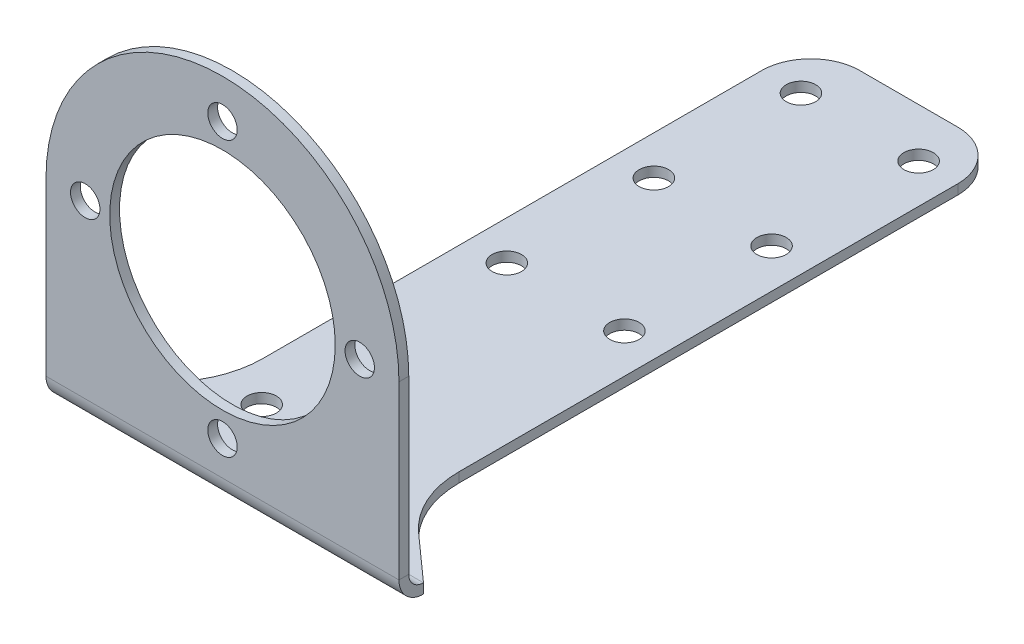
ISO-10303-21;
HEADER;
FILE_DESCRIPTION(('STEP AP214'),'2;1');
FILE_NAME('part.step','',(''),(''),'','','');
FILE_SCHEMA(('AUTOMOTIVE_DESIGN { 1 0 10303 214 1 1 1 1 }'));
ENDSEC;
DATA;
#1=APPLICATION_CONTEXT('core data for automotive mechanical design processes');
#2=APPLICATION_PROTOCOL_DEFINITION('international standard','automotive_design',2000,#1);
#3=PRODUCT_CONTEXT('',#1,'mechanical');
#4=PRODUCT('Part','Part','',(#3));
#5=PRODUCT_RELATED_PRODUCT_CATEGORY('part','',(#4));
#6=PRODUCT_DEFINITION_FORMATION('','',#4);
#7=PRODUCT_DEFINITION_CONTEXT('part definition',#1,'design');
#8=PRODUCT_DEFINITION('design','',#6,#7);
#9=PRODUCT_DEFINITION_SHAPE('','',#8);
#10=(LENGTH_UNIT() NAMED_UNIT(*) SI_UNIT(.MILLI.,.METRE.));
#11=(NAMED_UNIT(*) PLANE_ANGLE_UNIT() SI_UNIT($,.RADIAN.));
#12=(NAMED_UNIT(*) SI_UNIT($,.STERADIAN.) SOLID_ANGLE_UNIT());
#13=UNCERTAINTY_MEASURE_WITH_UNIT(LENGTH_MEASURE(1.E-05),#10,'distance_accuracy_value','');
#14=(GEOMETRIC_REPRESENTATION_CONTEXT(3) GLOBAL_UNCERTAINTY_ASSIGNED_CONTEXT((#13)) GLOBAL_UNIT_ASSIGNED_CONTEXT((#10,
#11,#12)) REPRESENTATION_CONTEXT('',''));
#15=CARTESIAN_POINT('',(0.,0.,0.));
#16=DIRECTION('',(0.,0.,1.));
#17=DIRECTION('',(1.,0.,0.));
#18=AXIS2_PLACEMENT_3D('',#15,#16,#17);
#19=CARTESIAN_POINT('',(0.,-10.,0.));
#20=DIRECTION('',(0.,1.,0.));
#21=DIRECTION('',(0.,0.,1.));
#22=AXIS2_PLACEMENT_3D('',#19,#20,#21);
#23=PLANE('',#22);
#24=DIRECTION('',(0.,0.,-1.));
#25=VECTOR('',#24,1.);
#26=CARTESIAN_POINT('',(-10.,-10.,0.));
#27=LINE('',#26,#25);
#28=CARTESIAN_POINT('',(-10.,-10.,-13.124622769065));
#29=VERTEX_POINT('',#28);
#30=CARTESIAN_POINT('',(-10.,-10.0000000000002,-64.));
#31=VERTEX_POINT('',#30);
#32=EDGE_CURVE('E179',#29,#31,#27,.T.);
#33=ORIENTED_EDGE('',*,*,#32,.T.);
#34=CARTESIAN_POINT('',(-5.,-10.0000000000002,-64.));
#35=DIRECTION('',(0.,1.,0.));
#36=DIRECTION('',(0.,0.,1.));
#37=AXIS2_PLACEMENT_3D('',#34,#35,#36);
#38=CIRCLE('',#37,5.);
#39=CARTESIAN_POINT('',(-5.,-10.0000000000002,-69.));
#40=VERTEX_POINT('',#39);
#41=EDGE_CURVE('E71',#31,#40,#38,.F.);
#42=ORIENTED_EDGE('',*,*,#41,.T.);
#43=DIRECTION('',(1.,0.,0.));
#44=VECTOR('',#43,1.);
#45=CARTESIAN_POINT('',(0.,-10.0000000000002,-69.));
#46=LINE('',#45,#44);
#47=CARTESIAN_POINT('',(5.,-10.0000000000002,-69.));
#48=VERTEX_POINT('',#47);
#49=EDGE_CURVE('E268',#40,#48,#46,.T.);
#50=ORIENTED_EDGE('',*,*,#49,.T.);
#51=CARTESIAN_POINT('',(5.,-10.0000000000002,-64.));
#52=DIRECTION('',(0.,1.,0.));
#53=DIRECTION('',(0.,0.,1.));
#54=AXIS2_PLACEMENT_3D('',#51,#52,#53);
#55=CIRCLE('',#54,5.);
#56=CARTESIAN_POINT('',(10.,-10.0000000000002,-64.));
#57=VERTEX_POINT('',#56);
#58=EDGE_CURVE('E78',#48,#57,#55,.F.);
#59=ORIENTED_EDGE('',*,*,#58,.T.);
#60=DIRECTION('',(0.,0.,-1.));
#61=VECTOR('',#60,1.);
#62=CARTESIAN_POINT('',(10.,-10.,0.));
#63=LINE('',#62,#61);
#64=CARTESIAN_POINT('',(10.,-10.,-13.124622769065));
#65=VERTEX_POINT('',#64);
#66=EDGE_CURVE('E246',#65,#57,#63,.T.);
#67=ORIENTED_EDGE('',*,*,#66,.F.);
#68=CARTESIAN_POINT('',(20.,-10.,-13.1246227690649));
#69=DIRECTION('',(0.,1.,0.));
#70=DIRECTION('',(0.,0.,1.));
#71=AXIS2_PLACEMENT_3D('',#68,#69,#70);
#72=CIRCLE('',#71,10.);
#73=CARTESIAN_POINT('',(13.3359357830151,-10.,-5.66873595984484));
#74=VERTEX_POINT('',#73);
#75=EDGE_CURVE('E255',#74,#65,#72,.F.);
#76=ORIENTED_EDGE('',*,*,#75,.F.);
#77=DIRECTION('',(-0.745588680922005,0.,-0.666406421698489));
#78=VECTOR('',#77,1.);
#79=CARTESIAN_POINT('',(8.73905296722593,-10.,-9.77742525009684));
#80=LINE('',#79,#78);
#81=CARTESIAN_POINT('',(18.,-10.,-1.49999999999999));
#82=VERTEX_POINT('',#81);
#83=EDGE_CURVE('E261',#82,#74,#80,.T.);
#84=ORIENTED_EDGE('',*,*,#83,.F.);
#85=DIRECTION('',(-1.,0.,0.));
#86=VECTOR('',#85,1.);
#87=CARTESIAN_POINT('',(18.,-10.,-1.49999999999999));
#88=LINE('',#87,#86);
#89=CARTESIAN_POINT('',(-18.,-10.,-1.49999999999999));
#90=VERTEX_POINT('',#89);
#91=EDGE_CURVE('E189',#90,#82,#88,.F.);
#92=ORIENTED_EDGE('',*,*,#91,.F.);
#93=DIRECTION('',(0.745588680922005,0.,-0.666406421698489));
#94=VECTOR('',#93,1.);
#95=CARTESIAN_POINT('',(-8.73905296722593,-10.,-9.77742525009684));
#96=LINE('',#95,#94);
#97=CARTESIAN_POINT('',(-13.3359357830151,-10.,-5.66873595984484));
#98=VERTEX_POINT('',#97);
#99=EDGE_CURVE('E171',#90,#98,#96,.T.);
#100=ORIENTED_EDGE('',*,*,#99,.T.);
#101=CARTESIAN_POINT('',(-20.,-10.,-13.1246227690649));
#102=DIRECTION('',(0.,1.,0.));
#103=DIRECTION('',(0.,0.,1.));
#104=AXIS2_PLACEMENT_3D('',#101,#102,#103);
#105=CIRCLE('',#104,10.);
#106=EDGE_CURVE('E182',#98,#29,#105,.T.);
#107=ORIENTED_EDGE('',*,*,#106,.T.);
#108=EDGE_LOOP('',(#33,#42,#50,#59,#67,#76,#84,#92,#100,#107));
#109=FACE_BOUND('',#108,.T.);
#110=CARTESIAN_POINT('',(-5.99999999999984,-10.0000000000002,-49.));
#111=DIRECTION('',(0.,1.,0.));
#112=DIRECTION('',(0.,0.,1.));
#113=AXIS2_PLACEMENT_3D('',#110,#111,#112);
#114=CIRCLE('',#113,1.5);
#115=CARTESIAN_POINT('',(-5.99999999999984,-10.0000000000002,-47.5));
#116=VERTEX_POINT('',#115);
#117=EDGE_CURVE('E236',#116,#116,#114,.T.);
#118=ORIENTED_EDGE('',*,*,#117,.T.);
#119=EDGE_LOOP('',(#118));
#120=FACE_BOUND('',#119,.T.);
#121=CARTESIAN_POINT('',(6.00000000000031,-10.0000000000001,-34.));
#122=DIRECTION('',(0.,1.,0.));
#123=DIRECTION('',(0.,0.,1.));
#124=AXIS2_PLACEMENT_3D('',#121,#122,#123);
#125=CIRCLE('',#124,1.5);
#126=CARTESIAN_POINT('',(6.00000000000031,-10.0000000000001,-32.5));
#127=VERTEX_POINT('',#126);
#128=EDGE_CURVE('E212',#127,#127,#125,.F.);
#129=ORIENTED_EDGE('',*,*,#128,.F.);
#130=EDGE_LOOP('',(#129));
#131=FACE_BOUND('',#130,.T.);
#132=CARTESIAN_POINT('',(-6.,-10.0000000000002,-64.));
#133=DIRECTION('',(0.,1.,0.));
#134=DIRECTION('',(0.,0.,1.));
#135=AXIS2_PLACEMENT_3D('',#132,#133,#134);
#136=CIRCLE('',#135,1.5);
#137=CARTESIAN_POINT('',(-6.,-10.0000000000002,-62.5));
#138=VERTEX_POINT('',#137);
#139=EDGE_CURVE('E224',#138,#138,#136,.T.);
#140=ORIENTED_EDGE('',*,*,#139,.T.);
#141=EDGE_LOOP('',(#140));
#142=FACE_BOUND('',#141,.T.);
#143=CARTESIAN_POINT('',(-5.99999999999969,-10.0000000000001,-34.));
#144=DIRECTION('',(0.,1.,0.));
#145=DIRECTION('',(0.,0.,1.));
#146=AXIS2_PLACEMENT_3D('',#143,#144,#145);
#147=CIRCLE('',#146,1.5);
#148=CARTESIAN_POINT('',(-5.99999999999969,-10.0000000000001,-32.5));
#149=VERTEX_POINT('',#148);
#150=EDGE_CURVE('E211',#149,#149,#147,.T.);
#151=ORIENTED_EDGE('',*,*,#150,.T.);
#152=EDGE_LOOP('',(#151));
#153=FACE_BOUND('',#152,.T.);
#154=CARTESIAN_POINT('',(-5.99999999999943,-10.,-9.));
#155=DIRECTION('',(0.,1.,0.));
#156=DIRECTION('',(0.,0.,1.));
#157=AXIS2_PLACEMENT_3D('',#154,#155,#156);
#158=CIRCLE('',#157,1.5);
#159=CARTESIAN_POINT('',(-5.99999999999943,-10.,-7.49999999999999));
#160=VERTEX_POINT('',#159);
#161=EDGE_CURVE('E204',#160,#160,#158,.T.);
#162=ORIENTED_EDGE('',*,*,#161,.T.);
#163=EDGE_LOOP('',(#162));
#164=FACE_BOUND('',#163,.T.);
#165=CARTESIAN_POINT('',(6.,-10.0000000000002,-64.));
#166=DIRECTION('',(0.,1.,0.));
#167=DIRECTION('',(0.,0.,1.));
#168=AXIS2_PLACEMENT_3D('',#165,#166,#167);
#169=CIRCLE('',#168,1.5);
#170=CARTESIAN_POINT('',(6.,-10.0000000000002,-62.5));
#171=VERTEX_POINT('',#170);
#172=EDGE_CURVE('E235',#171,#171,#169,.F.);
#173=ORIENTED_EDGE('',*,*,#172,.F.);
#174=EDGE_LOOP('',(#173));
#175=FACE_BOUND('',#174,.T.);
#176=CARTESIAN_POINT('',(6.00000000000015,-10.0000000000002,-49.));
#177=DIRECTION('',(0.,1.,0.));
#178=DIRECTION('',(0.,0.,1.));
#179=AXIS2_PLACEMENT_3D('',#176,#177,#178);
#180=CIRCLE('',#179,1.5);
#181=CARTESIAN_POINT('',(6.00000000000015,-10.0000000000002,-47.5));
#182=VERTEX_POINT('',#181);
#183=EDGE_CURVE('E223',#182,#182,#180,.F.);
#184=ORIENTED_EDGE('',*,*,#183,.F.);
#185=EDGE_LOOP('',(#184));
#186=FACE_BOUND('',#185,.T.);
#187=CARTESIAN_POINT('',(6.00000000000057,-10.,-9.));
#188=DIRECTION('',(0.,-1.,0.));
#189=DIRECTION('',(0.,0.,-1.));
#190=AXIS2_PLACEMENT_3D('',#187,#188,#189);
#191=CIRCLE('',#190,1.5);
#192=CARTESIAN_POINT('',(6.00000000000057,-10.,-10.5));
#193=VERTEX_POINT('',#192);
#194=EDGE_CURVE('E205',#193,#193,#191,.T.);
#195=ORIENTED_EDGE('',*,*,#194,.F.);
#196=EDGE_LOOP('',(#195));
#197=FACE_BOUND('',#196,.T.);
#198=ADVANCED_FACE('F63',(#109,#120,#131,#142,#153,#164,#175,#186,#197),#23,.F.);
#199=CARTESIAN_POINT('',(0.,-9.,0.));
#200=DIRECTION('',(0.,1.,0.));
#201=DIRECTION('',(0.,0.,1.));
#202=AXIS2_PLACEMENT_3D('',#199,#200,#201);
#203=PLANE('',#202);
#204=DIRECTION('',(-1.,0.,0.));
#205=VECTOR('',#204,1.);
#206=CARTESIAN_POINT('',(18.,-9.00000000000024,-69.));
#207=LINE('',#206,#205);
#208=CARTESIAN_POINT('',(-5.,-9.00000000000024,-69.));
#209=VERTEX_POINT('',#208);
#210=CARTESIAN_POINT('',(5.,-9.00000000000024,-69.));
#211=VERTEX_POINT('',#210);
#212=EDGE_CURVE('E271',#209,#211,#207,.F.);
#213=ORIENTED_EDGE('',*,*,#212,.F.);
#214=CARTESIAN_POINT('',(-5.,-9.00000000000022,-64.));
#215=DIRECTION('',(0.,1.,0.));
#216=DIRECTION('',(0.,0.,1.));
#217=AXIS2_PLACEMENT_3D('',#214,#215,#216);
#218=CIRCLE('',#217,5.);
#219=CARTESIAN_POINT('',(-10.,-9.00000000000022,-64.));
#220=VERTEX_POINT('',#219);
#221=EDGE_CURVE('E363',#209,#220,#218,.T.);
#222=ORIENTED_EDGE('',*,*,#221,.T.);
#223=DIRECTION('',(0.,0.,-1.));
#224=VECTOR('',#223,1.);
#225=CARTESIAN_POINT('',(-10.,-9.,0.));
#226=LINE('',#225,#224);
#227=CARTESIAN_POINT('',(-10.,-9.00000000000004,-13.124622769065));
#228=VERTEX_POINT('',#227);
#229=EDGE_CURVE('E190',#228,#220,#226,.T.);
#230=ORIENTED_EDGE('',*,*,#229,.F.);
#231=CARTESIAN_POINT('',(-20.,-9.00000000000004,-13.1246227690649));
#232=DIRECTION('',(0.,1.,0.));
#233=DIRECTION('',(0.,0.,1.));
#234=AXIS2_PLACEMENT_3D('',#231,#232,#233);
#235=CIRCLE('',#234,10.);
#236=CARTESIAN_POINT('',(-13.3359357830151,-9.00000000000002,-5.66873595984484));
#237=VERTEX_POINT('',#236);
#238=EDGE_CURVE('E192',#237,#228,#235,.T.);
#239=ORIENTED_EDGE('',*,*,#238,.F.);
#240=DIRECTION('',(0.745588680922005,0.,-0.666406421698489));
#241=VECTOR('',#240,1.);
#242=CARTESIAN_POINT('',(-8.73905296722593,-9.00000000000003,-9.77742525009685));
#243=LINE('',#242,#241);
#244=CARTESIAN_POINT('',(-18.,-9.,-1.49999999999999));
#245=VERTEX_POINT('',#244);
#246=EDGE_CURVE('E174',#245,#237,#243,.T.);
#247=ORIENTED_EDGE('',*,*,#246,.F.);
#248=DIRECTION('',(-1.,0.,0.));
#249=VECTOR('',#248,1.);
#250=CARTESIAN_POINT('',(18.,-9.00000000000001,-1.49999999999999));
#251=LINE('',#250,#249);
#252=CARTESIAN_POINT('',(18.,-9.,-1.49999999999999));
#253=VERTEX_POINT('',#252);
#254=EDGE_CURVE('E278',#253,#245,#251,.T.);
#255=ORIENTED_EDGE('',*,*,#254,.F.);
#256=DIRECTION('',(-0.745588680922005,0.,-0.666406421698489));
#257=VECTOR('',#256,1.);
#258=CARTESIAN_POINT('',(8.73905296722593,-9.00000000000003,-9.77742525009685));
#259=LINE('',#258,#257);
#260=CARTESIAN_POINT('',(13.3359357830151,-9.00000000000002,-5.66873595984484));
#261=VERTEX_POINT('',#260);
#262=EDGE_CURVE('E254',#253,#261,#259,.T.);
#263=ORIENTED_EDGE('',*,*,#262,.T.);
#264=CARTESIAN_POINT('',(20.,-9.00000000000004,-13.1246227690649));
#265=DIRECTION('',(0.,1.,0.));
#266=DIRECTION('',(0.,0.,1.));
#267=AXIS2_PLACEMENT_3D('',#264,#265,#266);
#268=CIRCLE('',#267,10.);
#269=CARTESIAN_POINT('',(10.,-9.00000000000004,-13.124622769065));
#270=VERTEX_POINT('',#269);
#271=EDGE_CURVE('E197',#261,#270,#268,.F.);
#272=ORIENTED_EDGE('',*,*,#271,.T.);
#273=DIRECTION('',(0.,0.,-1.));
#274=VECTOR('',#273,1.);
#275=CARTESIAN_POINT('',(10.,-9.,0.));
#276=LINE('',#275,#274);
#277=CARTESIAN_POINT('',(10.,-9.00000000000022,-64.));
#278=VERTEX_POINT('',#277);
#279=EDGE_CURVE('E251',#270,#278,#276,.T.);
#280=ORIENTED_EDGE('',*,*,#279,.T.);
#281=CARTESIAN_POINT('',(5.,-9.00000000000022,-64.));
#282=DIRECTION('',(0.,1.,0.));
#283=DIRECTION('',(0.,0.,1.));
#284=AXIS2_PLACEMENT_3D('',#281,#282,#283);
#285=CIRCLE('',#284,5.);
#286=EDGE_CURVE('E361',#278,#211,#285,.T.);
#287=ORIENTED_EDGE('',*,*,#286,.T.);
#288=EDGE_LOOP('',(#213,#222,#230,#239,#247,#255,#263,#272,#280,#287));
#289=FACE_BOUND('',#288,.T.);
#290=CARTESIAN_POINT('',(6.00000000000015,-9.00000000000017,-49.));
#291=DIRECTION('',(0.,1.,0.));
#292=DIRECTION('',(0.,0.,1.));
#293=AXIS2_PLACEMENT_3D('',#290,#291,#292);
#294=CIRCLE('',#293,1.5);
#295=CARTESIAN_POINT('',(6.00000000000015,-9.00000000000016,-47.5));
#296=VERTEX_POINT('',#295);
#297=EDGE_CURVE('E239',#296,#296,#294,.F.);
#298=ORIENTED_EDGE('',*,*,#297,.T.);
#299=EDGE_LOOP('',(#298));
#300=FACE_BOUND('',#299,.T.);
#301=CARTESIAN_POINT('',(-5.99999999999984,-9.00000000000017,-49.));
#302=DIRECTION('',(0.,1.,0.));
#303=DIRECTION('',(0.,0.,1.));
#304=AXIS2_PLACEMENT_3D('',#301,#302,#303);
#305=CIRCLE('',#304,1.5);
#306=CARTESIAN_POINT('',(-5.99999999999984,-9.00000000000016,-47.5));
#307=VERTEX_POINT('',#306);
#308=EDGE_CURVE('E232',#307,#307,#305,.T.);
#309=ORIENTED_EDGE('',*,*,#308,.F.);
#310=EDGE_LOOP('',(#309));
#311=FACE_BOUND('',#310,.T.);
#312=CARTESIAN_POINT('',(6.00000000000031,-9.00000000000012,-34.));
#313=DIRECTION('',(0.,1.,0.));
#314=DIRECTION('',(0.,0.,1.));
#315=AXIS2_PLACEMENT_3D('',#312,#313,#314);
#316=CIRCLE('',#315,1.5);
#317=CARTESIAN_POINT('',(6.00000000000031,-9.00000000000011,-32.5));
#318=VERTEX_POINT('',#317);
#319=EDGE_CURVE('E208',#318,#318,#316,.F.);
#320=ORIENTED_EDGE('',*,*,#319,.T.);
#321=EDGE_LOOP('',(#320));
#322=FACE_BOUND('',#321,.T.);
#323=CARTESIAN_POINT('',(-5.99999999999969,-9.00000000000012,-34.));
#324=DIRECTION('',(0.,1.,0.));
#325=DIRECTION('',(0.,0.,1.));
#326=AXIS2_PLACEMENT_3D('',#323,#324,#325);
#327=CIRCLE('',#326,1.5);
#328=CARTESIAN_POINT('',(-5.99999999999969,-9.00000000000011,-32.5));
#329=VERTEX_POINT('',#328);
#330=EDGE_CURVE('E227',#329,#329,#327,.T.);
#331=ORIENTED_EDGE('',*,*,#330,.F.);
#332=EDGE_LOOP('',(#331));
#333=FACE_BOUND('',#332,.T.);
#334=CARTESIAN_POINT('',(-6.,-9.00000000000022,-64.));
#335=DIRECTION('',(0.,1.,0.));
#336=DIRECTION('',(0.,0.,1.));
#337=AXIS2_PLACEMENT_3D('',#334,#335,#336);
#338=CIRCLE('',#337,1.5);
#339=CARTESIAN_POINT('',(-6.,-9.00000000000022,-62.5));
#340=VERTEX_POINT('',#339);
#341=EDGE_CURVE('E220',#340,#340,#338,.T.);
#342=ORIENTED_EDGE('',*,*,#341,.F.);
#343=EDGE_LOOP('',(#342));
#344=FACE_BOUND('',#343,.T.);
#345=CARTESIAN_POINT('',(-5.99999999999943,-9.00000000000003,-9.));
#346=DIRECTION('',(0.,1.,0.));
#347=DIRECTION('',(0.,0.,1.));
#348=AXIS2_PLACEMENT_3D('',#345,#346,#347);
#349=CIRCLE('',#348,1.5);
#350=CARTESIAN_POINT('',(-5.99999999999943,-9.00000000000002,-7.5));
#351=VERTEX_POINT('',#350);
#352=EDGE_CURVE('E215',#351,#351,#349,.T.);
#353=ORIENTED_EDGE('',*,*,#352,.F.);
#354=EDGE_LOOP('',(#353));
#355=FACE_BOUND('',#354,.T.);
#356=CARTESIAN_POINT('',(6.,-9.00000000000022,-64.));
#357=DIRECTION('',(0.,1.,0.));
#358=DIRECTION('',(0.,0.,1.));
#359=AXIS2_PLACEMENT_3D('',#356,#357,#358);
#360=CIRCLE('',#359,1.5);
#361=CARTESIAN_POINT('',(6.,-9.00000000000022,-62.5));
#362=VERTEX_POINT('',#361);
#363=EDGE_CURVE('E250',#362,#362,#360,.F.);
#364=ORIENTED_EDGE('',*,*,#363,.T.);
#365=EDGE_LOOP('',(#364));
#366=FACE_BOUND('',#365,.T.);
#367=CARTESIAN_POINT('',(6.00000000000057,-9.00000000000003,-9.));
#368=DIRECTION('',(0.,-1.,0.));
#369=DIRECTION('',(0.,0.,-1.));
#370=AXIS2_PLACEMENT_3D('',#367,#368,#369);
#371=CIRCLE('',#370,1.5);
#372=CARTESIAN_POINT('',(6.00000000000057,-9.00000000000003,-10.5));
#373=VERTEX_POINT('',#372);
#374=EDGE_CURVE('E201',#373,#373,#371,.T.);
#375=ORIENTED_EDGE('',*,*,#374,.T.);
#376=EDGE_LOOP('',(#375));
#377=FACE_BOUND('',#376,.T.);
#378=ADVANCED_FACE('F377',(#289,#300,#311,#322,#333,#344,#355,#366,#377),#203,.T.);
#379=CARTESIAN_POINT('',(18.,-10.0000000000002,-69.));
#380=DIRECTION('',(0.,0.,1.));
#381=DIRECTION('',(0.,-1.,0.));
#382=AXIS2_PLACEMENT_3D('',#379,#380,#381);
#383=PLANE('',#382);
#384=ORIENTED_EDGE('',*,*,#49,.F.);
#385=DIRECTION('',(0.,1.,0.));
#386=VECTOR('',#385,1.);
#387=CARTESIAN_POINT('',(-5.,-10.0000000000002,-69.));
#388=LINE('',#387,#386);
#389=EDGE_CURVE('E358',#40,#209,#388,.T.);
#390=ORIENTED_EDGE('',*,*,#389,.T.);
#391=ORIENTED_EDGE('',*,*,#212,.T.);
#392=DIRECTION('',(0.,1.,0.));
#393=VECTOR('',#392,1.);
#394=CARTESIAN_POINT('',(5.,-10.0000000000002,-69.));
#395=LINE('',#394,#393);
#396=EDGE_CURVE('E355',#211,#48,#395,.F.);
#397=ORIENTED_EDGE('',*,*,#396,.T.);
#398=EDGE_LOOP('',(#384,#390,#391,#397));
#399=FACE_BOUND('',#398,.T.);
#400=ADVANCED_FACE('F371',(#399),#383,.F.);
#401=CARTESIAN_POINT('',(-18.,0.,0.));
#402=DIRECTION('',(-1.,0.,0.));
#403=DIRECTION('',(0.,-1.,0.));
#404=AXIS2_PLACEMENT_3D('',#401,#402,#403);
#405=PLANE('',#404);
#406=DIRECTION('',(0.,-1.,0.));
#407=VECTOR('',#406,1.);
#408=CARTESIAN_POINT('',(-18.,0.,0.));
#409=LINE('',#408,#407);
#410=CARTESIAN_POINT('',(-18.,10.,0.));
#411=VERTEX_POINT('',#410);
#412=CARTESIAN_POINT('',(-18.,-7.50000000000001,0.));
#413=VERTEX_POINT('',#412);
#414=EDGE_CURVE('E312',#411,#413,#409,.T.);
#415=ORIENTED_EDGE('',*,*,#414,.T.);
#416=DIRECTION('',(0.,0.,1.));
#417=VECTOR('',#416,1.);
#418=CARTESIAN_POINT('',(-18.,-7.50000000000001,0.));
#419=LINE('',#418,#417);
#420=CARTESIAN_POINT('',(-18.,-7.50000000000001,1.));
#421=VERTEX_POINT('',#420);
#422=EDGE_CURVE('E289',#413,#421,#419,.T.);
#423=ORIENTED_EDGE('',*,*,#422,.T.);
#424=DIRECTION('',(0.,1.,0.));
#425=VECTOR('',#424,1.);
#426=CARTESIAN_POINT('',(-18.,0.,1.));
#427=LINE('',#426,#425);
#428=CARTESIAN_POINT('',(-18.,10.,1.));
#429=VERTEX_POINT('',#428);
#430=EDGE_CURVE('E334',#429,#421,#427,.F.);
#431=ORIENTED_EDGE('',*,*,#430,.F.);
#432=DIRECTION('',(0.,0.,-1.));
#433=VECTOR('',#432,1.);
#434=CARTESIAN_POINT('',(-18.,10.,0.));
#435=LINE('',#434,#433);
#436=EDGE_CURVE('E353',#429,#411,#435,.T.);
#437=ORIENTED_EDGE('',*,*,#436,.T.);
#438=EDGE_LOOP('',(#415,#423,#431,#437));
#439=FACE_BOUND('',#438,.T.);
#440=ADVANCED_FACE('F390',(#439),#405,.T.);
#441=CARTESIAN_POINT('',(0.,0.,0.));
#442=DIRECTION('',(0.,0.,1.));
#443=DIRECTION('',(1.,0.,0.));
#444=AXIS2_PLACEMENT_3D('',#441,#442,#443);
#445=PLANE('',#444);
#446=CARTESIAN_POINT('',(0.,10.,0.));
#447=DIRECTION('',(0.,0.,1.));
#448=DIRECTION('',(1.,0.,0.));
#449=AXIS2_PLACEMENT_3D('',#446,#447,#448);
#450=CIRCLE('',#449,11.5);
#451=CARTESIAN_POINT('',(11.5,10.,0.));
#452=VERTEX_POINT('',#451);
#453=EDGE_CURVE('E327',#452,#452,#450,.T.);
#454=ORIENTED_EDGE('',*,*,#453,.T.);
#455=EDGE_LOOP('',(#454));
#456=FACE_BOUND('',#455,.T.);
#457=CARTESIAN_POINT('',(0.,24.,0.));
#458=DIRECTION('',(0.,0.,1.));
#459=DIRECTION('',(1.,0.,0.));
#460=AXIS2_PLACEMENT_3D('',#457,#458,#459);
#461=CIRCLE('',#460,1.5);
#462=CARTESIAN_POINT('',(1.5,24.,0.));
#463=VERTEX_POINT('',#462);
#464=EDGE_CURVE('E324',#463,#463,#461,.T.);
#465=ORIENTED_EDGE('',*,*,#464,.T.);
#466=EDGE_LOOP('',(#465));
#467=FACE_BOUND('',#466,.T.);
#468=CARTESIAN_POINT('',(14.,10.,0.));
#469=DIRECTION('',(0.,0.,1.));
#470=DIRECTION('',(1.,0.,0.));
#471=AXIS2_PLACEMENT_3D('',#468,#469,#470);
#472=CIRCLE('',#471,1.5);
#473=CARTESIAN_POINT('',(15.5,10.,0.));
#474=VERTEX_POINT('',#473);
#475=EDGE_CURVE('E321',#474,#474,#472,.T.);
#476=ORIENTED_EDGE('',*,*,#475,.T.);
#477=EDGE_LOOP('',(#476));
#478=FACE_BOUND('',#477,.T.);
#479=CARTESIAN_POINT('',(0.,-3.99999999999999,0.));
#480=DIRECTION('',(0.,0.,1.));
#481=DIRECTION('',(1.,0.,0.));
#482=AXIS2_PLACEMENT_3D('',#479,#480,#481);
#483=CIRCLE('',#482,1.5);
#484=CARTESIAN_POINT('',(1.5,-3.99999999999999,0.));
#485=VERTEX_POINT('',#484);
#486=EDGE_CURVE('E318',#485,#485,#483,.T.);
#487=ORIENTED_EDGE('',*,*,#486,.T.);
#488=EDGE_LOOP('',(#487));
#489=FACE_BOUND('',#488,.T.);
#490=CARTESIAN_POINT('',(-14.,10.,0.));
#491=DIRECTION('',(0.,0.,1.));
#492=DIRECTION('',(1.,0.,0.));
#493=AXIS2_PLACEMENT_3D('',#490,#491,#492);
#494=CIRCLE('',#493,1.5);
#495=CARTESIAN_POINT('',(-12.5,10.,0.));
#496=VERTEX_POINT('',#495);
#497=EDGE_CURVE('E315',#496,#496,#494,.T.);
#498=ORIENTED_EDGE('',*,*,#497,.T.);
#499=EDGE_LOOP('',(#498));
#500=FACE_BOUND('',#499,.T.);
#501=DIRECTION('',(-1.,0.,0.));
#502=VECTOR('',#501,1.);
#503=CARTESIAN_POINT('',(-18.,-7.50000000000001,0.));
#504=LINE('',#503,#502);
#505=CARTESIAN_POINT('',(18.,-7.50000000000001,0.));
#506=VERTEX_POINT('',#505);
#507=EDGE_CURVE('E295',#413,#506,#504,.F.);
#508=ORIENTED_EDGE('',*,*,#507,.F.);
#509=ORIENTED_EDGE('',*,*,#414,.F.);
#510=CARTESIAN_POINT('',(0.,10.,0.));
#511=DIRECTION('',(0.,0.,1.));
#512=DIRECTION('',(1.,0.,0.));
#513=AXIS2_PLACEMENT_3D('',#510,#511,#512);
#514=CIRCLE('',#513,18.);
#515=CARTESIAN_POINT('',(18.,10.,0.));
#516=VERTEX_POINT('',#515);
#517=EDGE_CURVE('E305',#516,#411,#514,.T.);
#518=ORIENTED_EDGE('',*,*,#517,.F.);
#519=DIRECTION('',(0.,-1.,0.));
#520=VECTOR('',#519,1.);
#521=CARTESIAN_POINT('',(18.,0.,0.));
#522=LINE('',#521,#520);
#523=EDGE_CURVE('E308',#516,#506,#522,.T.);
#524=ORIENTED_EDGE('',*,*,#523,.T.);
#525=EDGE_LOOP('',(#508,#509,#518,#524));
#526=FACE_BOUND('',#525,.T.);
#527=ADVANCED_FACE('F401',(#456,#467,#478,#489,#500,#526),#445,.F.);
#528=CARTESIAN_POINT('',(0.,0.,1.));
#529=DIRECTION('',(0.,0.,1.));
#530=DIRECTION('',(1.,0.,0.));
#531=AXIS2_PLACEMENT_3D('',#528,#529,#530);
#532=PLANE('',#531);
#533=CARTESIAN_POINT('',(-14.,10.,1.));
#534=DIRECTION('',(0.,0.,1.));
#535=DIRECTION('',(1.,0.,0.));
#536=AXIS2_PLACEMENT_3D('',#533,#534,#535);
#537=CIRCLE('',#536,1.5);
#538=CARTESIAN_POINT('',(-12.5,10.,1.));
#539=VERTEX_POINT('',#538);
#540=EDGE_CURVE('E337',#539,#539,#537,.T.);
#541=ORIENTED_EDGE('',*,*,#540,.F.);
#542=EDGE_LOOP('',(#541));
#543=FACE_BOUND('',#542,.T.);
#544=CARTESIAN_POINT('',(0.,-3.99999999999999,1.));
#545=DIRECTION('',(0.,0.,1.));
#546=DIRECTION('',(1.,0.,0.));
#547=AXIS2_PLACEMENT_3D('',#544,#545,#546);
#548=CIRCLE('',#547,1.5);
#549=CARTESIAN_POINT('',(1.5,-3.99999999999999,1.));
#550=VERTEX_POINT('',#549);
#551=EDGE_CURVE('E342',#550,#550,#548,.T.);
#552=ORIENTED_EDGE('',*,*,#551,.F.);
#553=EDGE_LOOP('',(#552));
#554=FACE_BOUND('',#553,.T.);
#555=CARTESIAN_POINT('',(14.,10.,1.));
#556=DIRECTION('',(0.,0.,1.));
#557=DIRECTION('',(1.,0.,0.));
#558=AXIS2_PLACEMENT_3D('',#555,#556,#557);
#559=CIRCLE('',#558,1.5);
#560=CARTESIAN_POINT('',(15.5,10.,1.));
#561=VERTEX_POINT('',#560);
#562=EDGE_CURVE('E345',#561,#561,#559,.T.);
#563=ORIENTED_EDGE('',*,*,#562,.F.);
#564=EDGE_LOOP('',(#563));
#565=FACE_BOUND('',#564,.T.);
#566=CARTESIAN_POINT('',(0.,24.,1.));
#567=DIRECTION('',(0.,0.,1.));
#568=DIRECTION('',(1.,0.,0.));
#569=AXIS2_PLACEMENT_3D('',#566,#567,#568);
#570=CIRCLE('',#569,1.5);
#571=CARTESIAN_POINT('',(1.5,24.,1.));
#572=VERTEX_POINT('',#571);
#573=EDGE_CURVE('E348',#572,#572,#570,.T.);
#574=ORIENTED_EDGE('',*,*,#573,.F.);
#575=EDGE_LOOP('',(#574));
#576=FACE_BOUND('',#575,.T.);
#577=CARTESIAN_POINT('',(0.,10.,1.));
#578=DIRECTION('',(0.,0.,1.));
#579=DIRECTION('',(1.,0.,0.));
#580=AXIS2_PLACEMENT_3D('',#577,#578,#579);
#581=CIRCLE('',#580,11.5);
#582=CARTESIAN_POINT('',(11.5,10.,1.));
#583=VERTEX_POINT('',#582);
#584=EDGE_CURVE('E309',#583,#583,#581,.T.);
#585=ORIENTED_EDGE('',*,*,#584,.F.);
#586=EDGE_LOOP('',(#585));
#587=FACE_BOUND('',#586,.T.);
#588=ORIENTED_EDGE('',*,*,#430,.T.);
#589=DIRECTION('',(-1.,0.,0.));
#590=VECTOR('',#589,1.);
#591=CARTESIAN_POINT('',(-18.,-7.50000000000001,1.));
#592=LINE('',#591,#590);
#593=CARTESIAN_POINT('',(18.,-7.50000000000001,1.));
#594=VERTEX_POINT('',#593);
#595=EDGE_CURVE('E282',#421,#594,#592,.F.);
#596=ORIENTED_EDGE('',*,*,#595,.T.);
#597=DIRECTION('',(0.,1.,0.));
#598=VECTOR('',#597,1.);
#599=CARTESIAN_POINT('',(18.,0.,1.));
#600=LINE('',#599,#598);
#601=CARTESIAN_POINT('',(18.,10.,1.));
#602=VERTEX_POINT('',#601);
#603=EDGE_CURVE('E333',#602,#594,#600,.F.);
#604=ORIENTED_EDGE('',*,*,#603,.F.);
#605=CARTESIAN_POINT('',(0.,10.,1.));
#606=DIRECTION('',(0.,0.,1.));
#607=DIRECTION('',(1.,0.,0.));
#608=AXIS2_PLACEMENT_3D('',#605,#606,#607);
#609=CIRCLE('',#608,18.);
#610=EDGE_CURVE('E302',#602,#429,#609,.T.);
#611=ORIENTED_EDGE('',*,*,#610,.T.);
#612=EDGE_LOOP('',(#588,#596,#604,#611));
#613=FACE_BOUND('',#612,.T.);
#614=ADVANCED_FACE('F393',(#543,#554,#565,#576,#587,#613),#532,.T.);
#615=CARTESIAN_POINT('',(0.,10.,0.));
#616=DIRECTION('',(0.,0.,1.));
#617=DIRECTION('',(1.,0.,0.));
#618=AXIS2_PLACEMENT_3D('',#615,#616,#617);
#619=CYLINDRICAL_SURFACE('',#618,18.);
#620=ORIENTED_EDGE('',*,*,#436,.F.);
#621=ORIENTED_EDGE('',*,*,#610,.F.);
#622=DIRECTION('',(0.,0.,-1.));
#623=VECTOR('',#622,1.);
#624=CARTESIAN_POINT('',(18.,10.,0.));
#625=LINE('',#624,#623);
#626=EDGE_CURVE('E330',#602,#516,#625,.T.);
#627=ORIENTED_EDGE('',*,*,#626,.T.);
#628=ORIENTED_EDGE('',*,*,#517,.T.);
#629=EDGE_LOOP('',(#620,#621,#627,#628));
#630=FACE_BOUND('',#629,.T.);
#631=ADVANCED_FACE('F397',(#630),#619,.T.);
#632=CARTESIAN_POINT('',(18.,0.,0.));
#633=DIRECTION('',(-1.,0.,0.));
#634=DIRECTION('',(0.,-1.,0.));
#635=AXIS2_PLACEMENT_3D('',#632,#633,#634);
#636=PLANE('',#635);
#637=DIRECTION('',(0.,0.,1.));
#638=VECTOR('',#637,1.);
#639=CARTESIAN_POINT('',(18.,-7.50000000000001,0.));
#640=LINE('',#639,#638);
#641=EDGE_CURVE('E299',#506,#594,#640,.T.);
#642=ORIENTED_EDGE('',*,*,#641,.F.);
#643=ORIENTED_EDGE('',*,*,#523,.F.);
#644=ORIENTED_EDGE('',*,*,#626,.F.);
#645=ORIENTED_EDGE('',*,*,#603,.T.);
#646=EDGE_LOOP('',(#642,#643,#644,#645));
#647=FACE_BOUND('',#646,.T.);
#648=ADVANCED_FACE('F407',(#647),#636,.F.);
#649=CARTESIAN_POINT('',(-14.,10.,0.));
#650=DIRECTION('',(0.,0.,1.));
#651=DIRECTION('',(1.,0.,0.));
#652=AXIS2_PLACEMENT_3D('',#649,#650,#651);
#653=CYLINDRICAL_SURFACE('',#652,1.5);
#654=ORIENTED_EDGE('',*,*,#497,.F.);
#655=EDGE_LOOP('',(#654));
#656=FACE_BOUND('',#655,.T.);
#657=ORIENTED_EDGE('',*,*,#540,.T.);
#658=EDGE_LOOP('',(#657));
#659=FACE_BOUND('',#658,.T.);
#660=ADVANCED_FACE('F409',(#656,#659),#653,.F.);
#661=CARTESIAN_POINT('',(0.,-3.99999999999999,0.));
#662=DIRECTION('',(0.,0.,1.));
#663=DIRECTION('',(1.,0.,0.));
#664=AXIS2_PLACEMENT_3D('',#661,#662,#663);
#665=CYLINDRICAL_SURFACE('',#664,1.5);
#666=ORIENTED_EDGE('',*,*,#486,.F.);
#667=EDGE_LOOP('',(#666));
#668=FACE_BOUND('',#667,.T.);
#669=ORIENTED_EDGE('',*,*,#551,.T.);
#670=EDGE_LOOP('',(#669));
#671=FACE_BOUND('',#670,.T.);
#672=ADVANCED_FACE('F415',(#668,#671),#665,.F.);
#673=CARTESIAN_POINT('',(14.,10.,0.));
#674=DIRECTION('',(0.,0.,1.));
#675=DIRECTION('',(1.,0.,0.));
#676=AXIS2_PLACEMENT_3D('',#673,#674,#675);
#677=CYLINDRICAL_SURFACE('',#676,1.5);
#678=ORIENTED_EDGE('',*,*,#475,.F.);
#679=EDGE_LOOP('',(#678));
#680=FACE_BOUND('',#679,.T.);
#681=ORIENTED_EDGE('',*,*,#562,.T.);
#682=EDGE_LOOP('',(#681));
#683=FACE_BOUND('',#682,.T.);
#684=ADVANCED_FACE('F486',(#680,#683),#677,.F.);
#685=CARTESIAN_POINT('',(0.,24.,0.));
#686=DIRECTION('',(0.,0.,1.));
#687=DIRECTION('',(1.,0.,0.));
#688=AXIS2_PLACEMENT_3D('',#685,#686,#687);
#689=CYLINDRICAL_SURFACE('',#688,1.5);
#690=ORIENTED_EDGE('',*,*,#464,.F.);
#691=EDGE_LOOP('',(#690));
#692=FACE_BOUND('',#691,.T.);
#693=ORIENTED_EDGE('',*,*,#573,.T.);
#694=EDGE_LOOP('',(#693));
#695=FACE_BOUND('',#694,.T.);
#696=ADVANCED_FACE('F497',(#692,#695),#689,.F.);
#697=CARTESIAN_POINT('',(0.,10.,0.));
#698=DIRECTION('',(0.,0.,1.));
#699=DIRECTION('',(1.,0.,0.));
#700=AXIS2_PLACEMENT_3D('',#697,#698,#699);
#701=CYLINDRICAL_SURFACE('',#700,11.5);
#702=ORIENTED_EDGE('',*,*,#453,.F.);
#703=EDGE_LOOP('',(#702));
#704=FACE_BOUND('',#703,.T.);
#705=ORIENTED_EDGE('',*,*,#584,.T.);
#706=EDGE_LOOP('',(#705));
#707=FACE_BOUND('',#706,.T.);
#708=ADVANCED_FACE('F441',(#704,#707),#701,.F.);
#709=CARTESIAN_POINT('',(18.,-7.50000000000001,-1.5));
#710=DIRECTION('',(1.,0.,0.));
#711=DIRECTION('',(0.,0.,-1.));
#712=AXIS2_PLACEMENT_3D('',#709,#710,#711);
#713=PLANE('',#712);
#714=DIRECTION('',(0.,1.,0.));
#715=VECTOR('',#714,1.);
#716=CARTESIAN_POINT('',(18.,-10.,-1.49999999999999));
#717=LINE('',#716,#715);
#718=EDGE_CURVE('E199',#253,#82,#717,.F.);
#719=ORIENTED_EDGE('',*,*,#718,.F.);
#720=CARTESIAN_POINT('',(18.,-7.50000000000001,-1.5));
#721=DIRECTION('',(-1.,0.,0.));
#722=DIRECTION('',(0.,0.,1.));
#723=AXIS2_PLACEMENT_3D('',#720,#721,#722);
#724=CIRCLE('',#723,1.5);
#725=EDGE_CURVE('E292',#506,#253,#724,.F.);
#726=ORIENTED_EDGE('',*,*,#725,.F.);
#727=ORIENTED_EDGE('',*,*,#641,.T.);
#728=CARTESIAN_POINT('',(18.,-7.50000000000001,-1.5));
#729=DIRECTION('',(-1.,0.,0.));
#730=DIRECTION('',(0.,0.,1.));
#731=AXIS2_PLACEMENT_3D('',#728,#729,#730);
#732=CIRCLE('',#731,2.5);
#733=EDGE_CURVE('E285',#594,#82,#732,.F.);
#734=ORIENTED_EDGE('',*,*,#733,.T.);
#735=EDGE_LOOP('',(#719,#726,#727,#734));
#736=FACE_BOUND('',#735,.T.);
#737=ADVANCED_FACE('F405',(#736),#713,.T.);
#738=CARTESIAN_POINT('',(-18.,-7.50000000000001,-1.5));
#739=DIRECTION('',(1.,0.,0.));
#740=DIRECTION('',(0.,0.,-1.));
#741=AXIS2_PLACEMENT_3D('',#738,#739,#740);
#742=PLANE('',#741);
#743=CARTESIAN_POINT('',(-18.,-7.50000000000001,-1.5));
#744=DIRECTION('',(-1.,0.,0.));
#745=DIRECTION('',(0.,0.,1.));
#746=AXIS2_PLACEMENT_3D('',#743,#744,#745);
#747=CIRCLE('',#746,1.5);
#748=EDGE_CURVE('E270',#245,#413,#747,.T.);
#749=ORIENTED_EDGE('',*,*,#748,.F.);
#750=DIRECTION('',(0.,1.,0.));
#751=VECTOR('',#750,1.);
#752=CARTESIAN_POINT('',(-18.,-9.00000000000001,-1.49999999999999));
#753=LINE('',#752,#751);
#754=EDGE_CURVE('E275',#245,#90,#753,.F.);
#755=ORIENTED_EDGE('',*,*,#754,.T.);
#756=CARTESIAN_POINT('',(-18.,-7.50000000000001,-1.5));
#757=DIRECTION('',(-1.,0.,0.));
#758=DIRECTION('',(0.,0.,1.));
#759=AXIS2_PLACEMENT_3D('',#756,#757,#758);
#760=CIRCLE('',#759,2.5);
#761=EDGE_CURVE('E286',#90,#421,#760,.T.);
#762=ORIENTED_EDGE('',*,*,#761,.T.);
#763=ORIENTED_EDGE('',*,*,#422,.F.);
#764=EDGE_LOOP('',(#749,#755,#762,#763));
#765=FACE_BOUND('',#764,.T.);
#766=ADVANCED_FACE('F387',(#765),#742,.F.);
#767=CARTESIAN_POINT('',(-18.,-7.50000000000001,-1.5));
#768=DIRECTION('',(-1.,0.,0.));
#769=DIRECTION('',(0.,-1.,0.));
#770=AXIS2_PLACEMENT_3D('',#767,#768,#769);
#771=CYLINDRICAL_SURFACE('',#770,2.5);
#772=ORIENTED_EDGE('',*,*,#595,.F.);
#773=ORIENTED_EDGE('',*,*,#761,.F.);
#774=ORIENTED_EDGE('',*,*,#91,.T.);
#775=ORIENTED_EDGE('',*,*,#733,.F.);
#776=EDGE_LOOP('',(#772,#773,#774,#775));
#777=FACE_BOUND('',#776,.T.);
#778=ADVANCED_FACE('F432',(#777),#771,.T.);
#779=CARTESIAN_POINT('',(-18.,-7.50000000000001,-1.5));
#780=DIRECTION('',(-1.,0.,0.));
#781=DIRECTION('',(0.,-1.,0.));
#782=AXIS2_PLACEMENT_3D('',#779,#780,#781);
#783=CYLINDRICAL_SURFACE('',#782,1.5);
#784=ORIENTED_EDGE('',*,*,#507,.T.);
#785=ORIENTED_EDGE('',*,*,#725,.T.);
#786=ORIENTED_EDGE('',*,*,#254,.T.);
#787=ORIENTED_EDGE('',*,*,#748,.T.);
#788=EDGE_LOOP('',(#784,#785,#786,#787));
#789=FACE_BOUND('',#788,.T.);
#790=ADVANCED_FACE('F383',(#789),#783,.F.);
#791=CARTESIAN_POINT('',(20.,-10.,-13.1246227690649));
#792=DIRECTION('',(0.,1.,0.));
#793=DIRECTION('',(0.,0.,1.));
#794=AXIS2_PLACEMENT_3D('',#791,#792,#793);
#795=CYLINDRICAL_SURFACE('',#794,10.);
#796=ORIENTED_EDGE('',*,*,#271,.F.);
#797=DIRECTION('',(0.,1.,0.));
#798=VECTOR('',#797,1.);
#799=CARTESIAN_POINT('',(13.3359357830151,-10.,-5.66873595984484));
#800=LINE('',#799,#798);
#801=EDGE_CURVE('E244',#74,#261,#800,.T.);
#802=ORIENTED_EDGE('',*,*,#801,.F.);
#803=ORIENTED_EDGE('',*,*,#75,.T.);
#804=DIRECTION('',(0.,1.,0.));
#805=VECTOR('',#804,1.);
#806=CARTESIAN_POINT('',(10.,-10.,-13.124622769065));
#807=LINE('',#806,#805);
#808=EDGE_CURVE('E247',#65,#270,#807,.T.);
#809=ORIENTED_EDGE('',*,*,#808,.T.);
#810=EDGE_LOOP('',(#796,#802,#803,#809));
#811=FACE_BOUND('',#810,.T.);
#812=ADVANCED_FACE('F438',(#811),#795,.F.);
#813=CARTESIAN_POINT('',(10.,-10.,0.));
#814=DIRECTION('',(1.,0.,0.));
#815=DIRECTION('',(0.,0.,-1.));
#816=AXIS2_PLACEMENT_3D('',#813,#814,#815);
#817=PLANE('',#816);
#818=ORIENTED_EDGE('',*,*,#66,.T.);
#819=DIRECTION('',(0.,1.,0.));
#820=VECTOR('',#819,1.);
#821=CARTESIAN_POINT('',(10.,-9.00000000000022,-64.));
#822=LINE('',#821,#820);
#823=EDGE_CURVE('E13',#57,#278,#822,.T.);
#824=ORIENTED_EDGE('',*,*,#823,.T.);
#825=ORIENTED_EDGE('',*,*,#279,.F.);
#826=ORIENTED_EDGE('',*,*,#808,.F.);
#827=EDGE_LOOP('',(#818,#824,#825,#826));
#828=FACE_BOUND('',#827,.T.);
#829=ADVANCED_FACE('F542',(#828),#817,.T.);
#830=CARTESIAN_POINT('',(8.73905296722593,-10.,-9.77742525009684));
#831=DIRECTION('',(0.666406421698489,0.,-0.745588680922005));
#832=DIRECTION('',(-0.745588680922005,0.,-0.666406421698489));
#833=AXIS2_PLACEMENT_3D('',#830,#831,#832);
#834=PLANE('',#833);
#835=ORIENTED_EDGE('',*,*,#262,.F.);
#836=ORIENTED_EDGE('',*,*,#718,.T.);
#837=ORIENTED_EDGE('',*,*,#83,.T.);
#838=ORIENTED_EDGE('',*,*,#801,.T.);
#839=EDGE_LOOP('',(#835,#836,#837,#838));
#840=FACE_BOUND('',#839,.T.);
#841=ADVANCED_FACE('F551',(#840),#834,.T.);
#842=CARTESIAN_POINT('',(-8.73905296722593,-10.,-9.77742525009684));
#843=DIRECTION('',(0.666406421698489,0.,0.745588680922005));
#844=DIRECTION('',(0.745588680922005,0.,-0.666406421698489));
#845=AXIS2_PLACEMENT_3D('',#842,#843,#844);
#846=PLANE('',#845);
#847=ORIENTED_EDGE('',*,*,#246,.T.);
#848=DIRECTION('',(0.,1.,0.));
#849=VECTOR('',#848,1.);
#850=CARTESIAN_POINT('',(-13.3359357830151,-10.,-5.66873595984484));
#851=LINE('',#850,#849);
#852=EDGE_CURVE('E167',#98,#237,#851,.T.);
#853=ORIENTED_EDGE('',*,*,#852,.F.);
#854=ORIENTED_EDGE('',*,*,#99,.F.);
#855=ORIENTED_EDGE('',*,*,#754,.F.);
#856=EDGE_LOOP('',(#847,#853,#854,#855));
#857=FACE_BOUND('',#856,.T.);
#858=ADVANCED_FACE('F169',(#857),#846,.F.);
#859=CARTESIAN_POINT('',(-10.,-10.,0.));
#860=DIRECTION('',(1.,0.,0.));
#861=DIRECTION('',(0.,0.,-1.));
#862=AXIS2_PLACEMENT_3D('',#859,#860,#861);
#863=PLANE('',#862);
#864=ORIENTED_EDGE('',*,*,#229,.T.);
#865=DIRECTION('',(0.,1.,0.));
#866=VECTOR('',#865,1.);
#867=CARTESIAN_POINT('',(-10.,-10.0000000000002,-64.));
#868=LINE('',#867,#866);
#869=EDGE_CURVE('E86',#220,#31,#868,.F.);
#870=ORIENTED_EDGE('',*,*,#869,.T.);
#871=ORIENTED_EDGE('',*,*,#32,.F.);
#872=DIRECTION('',(0.,1.,0.));
#873=VECTOR('',#872,1.);
#874=CARTESIAN_POINT('',(-10.,-10.,-13.124622769065));
#875=LINE('',#874,#873);
#876=EDGE_CURVE('E178',#29,#228,#875,.T.);
#877=ORIENTED_EDGE('',*,*,#876,.T.);
#878=EDGE_LOOP('',(#864,#870,#871,#877));
#879=FACE_BOUND('',#878,.T.);
#880=ADVANCED_FACE('F379',(#879),#863,.F.);
#881=CARTESIAN_POINT('',(-20.,-10.,-13.1246227690649));
#882=DIRECTION('',(0.,1.,0.));
#883=DIRECTION('',(0.,0.,1.));
#884=AXIS2_PLACEMENT_3D('',#881,#882,#883);
#885=CYLINDRICAL_SURFACE('',#884,10.);
#886=ORIENTED_EDGE('',*,*,#238,.T.);
#887=ORIENTED_EDGE('',*,*,#876,.F.);
#888=ORIENTED_EDGE('',*,*,#106,.F.);
#889=ORIENTED_EDGE('',*,*,#852,.T.);
#890=EDGE_LOOP('',(#886,#887,#888,#889));
#891=FACE_BOUND('',#890,.T.);
#892=ADVANCED_FACE('F183',(#891),#885,.F.);
#893=CARTESIAN_POINT('',(-6.,-10.0000000000002,-64.));
#894=DIRECTION('',(0.,1.,0.));
#895=DIRECTION('',(0.,0.,1.));
#896=AXIS2_PLACEMENT_3D('',#893,#894,#895);
#897=CYLINDRICAL_SURFACE('',#896,1.5);
#898=ORIENTED_EDGE('',*,*,#139,.F.);
#899=EDGE_LOOP('',(#898));
#900=FACE_BOUND('',#899,.T.);
#901=ORIENTED_EDGE('',*,*,#341,.T.);
#902=EDGE_LOOP('',(#901));
#903=FACE_BOUND('',#902,.T.);
#904=ADVANCED_FACE('F577',(#900,#903),#897,.F.);
#905=CARTESIAN_POINT('',(-5.99999999999969,-10.0000000000001,-34.));
#906=DIRECTION('',(0.,1.,0.));
#907=DIRECTION('',(0.,0.,1.));
#908=AXIS2_PLACEMENT_3D('',#905,#906,#907);
#909=CYLINDRICAL_SURFACE('',#908,1.5);
#910=ORIENTED_EDGE('',*,*,#150,.F.);
#911=EDGE_LOOP('',(#910));
#912=FACE_BOUND('',#911,.T.);
#913=ORIENTED_EDGE('',*,*,#330,.T.);
#914=EDGE_LOOP('',(#913));
#915=FACE_BOUND('',#914,.T.);
#916=ADVANCED_FACE('F584',(#912,#915),#909,.F.);
#917=CARTESIAN_POINT('',(6.00000000000031,-10.0000000000001,-34.));
#918=DIRECTION('',(0.,1.,0.));
#919=DIRECTION('',(0.,0.,1.));
#920=AXIS2_PLACEMENT_3D('',#917,#918,#919);
#921=CYLINDRICAL_SURFACE('',#920,1.5);
#922=ORIENTED_EDGE('',*,*,#128,.T.);
#923=EDGE_LOOP('',(#922));
#924=FACE_BOUND('',#923,.T.);
#925=ORIENTED_EDGE('',*,*,#319,.F.);
#926=EDGE_LOOP('',(#925));
#927=FACE_BOUND('',#926,.T.);
#928=ADVANCED_FACE('F592',(#924,#927),#921,.F.);
#929=CARTESIAN_POINT('',(-5.99999999999943,-10.,-9.));
#930=DIRECTION('',(0.,1.,0.));
#931=DIRECTION('',(0.,0.,1.));
#932=AXIS2_PLACEMENT_3D('',#929,#930,#931);
#933=CYLINDRICAL_SURFACE('',#932,1.5);
#934=ORIENTED_EDGE('',*,*,#161,.F.);
#935=EDGE_LOOP('',(#934));
#936=FACE_BOUND('',#935,.T.);
#937=ORIENTED_EDGE('',*,*,#352,.T.);
#938=EDGE_LOOP('',(#937));
#939=FACE_BOUND('',#938,.T.);
#940=ADVANCED_FACE('F600',(#936,#939),#933,.F.);
#941=CARTESIAN_POINT('',(6.,-10.0000000000002,-64.));
#942=DIRECTION('',(0.,1.,0.));
#943=DIRECTION('',(0.,0.,1.));
#944=AXIS2_PLACEMENT_3D('',#941,#942,#943);
#945=CYLINDRICAL_SURFACE('',#944,1.5);
#946=ORIENTED_EDGE('',*,*,#172,.T.);
#947=EDGE_LOOP('',(#946));
#948=FACE_BOUND('',#947,.T.);
#949=ORIENTED_EDGE('',*,*,#363,.F.);
#950=EDGE_LOOP('',(#949));
#951=FACE_BOUND('',#950,.T.);
#952=ADVANCED_FACE('F427',(#948,#951),#945,.F.);
#953=CARTESIAN_POINT('',(-5.99999999999984,-10.0000000000002,-49.));
#954=DIRECTION('',(0.,1.,0.));
#955=DIRECTION('',(0.,0.,1.));
#956=AXIS2_PLACEMENT_3D('',#953,#954,#955);
#957=CYLINDRICAL_SURFACE('',#956,1.5);
#958=ORIENTED_EDGE('',*,*,#117,.F.);
#959=EDGE_LOOP('',(#958));
#960=FACE_BOUND('',#959,.T.);
#961=ORIENTED_EDGE('',*,*,#308,.T.);
#962=EDGE_LOOP('',(#961));
#963=FACE_BOUND('',#962,.T.);
#964=ADVANCED_FACE('F615',(#960,#963),#957,.F.);
#965=CARTESIAN_POINT('',(6.00000000000015,-10.0000000000002,-49.));
#966=DIRECTION('',(0.,1.,0.));
#967=DIRECTION('',(0.,0.,1.));
#968=AXIS2_PLACEMENT_3D('',#965,#966,#967);
#969=CYLINDRICAL_SURFACE('',#968,1.5);
#970=ORIENTED_EDGE('',*,*,#183,.T.);
#971=EDGE_LOOP('',(#970));
#972=FACE_BOUND('',#971,.T.);
#973=ORIENTED_EDGE('',*,*,#297,.F.);
#974=EDGE_LOOP('',(#973));
#975=FACE_BOUND('',#974,.T.);
#976=ADVANCED_FACE('F622',(#972,#975),#969,.F.);
#977=CARTESIAN_POINT('',(6.00000000000057,-10.,-9.));
#978=DIRECTION('',(0.,1.,0.));
#979=DIRECTION('',(0.,0.,1.));
#980=AXIS2_PLACEMENT_3D('',#977,#978,#979);
#981=CYLINDRICAL_SURFACE('',#980,1.5);
#982=ORIENTED_EDGE('',*,*,#194,.T.);
#983=EDGE_LOOP('',(#982));
#984=FACE_BOUND('',#983,.T.);
#985=ORIENTED_EDGE('',*,*,#374,.F.);
#986=EDGE_LOOP('',(#985));
#987=FACE_BOUND('',#986,.T.);
#988=ADVANCED_FACE('F630',(#984,#987),#981,.F.);
#989=CARTESIAN_POINT('',(-5.,-10.0000000000002,-64.));
#990=DIRECTION('',(0.,1.,0.));
#991=DIRECTION('',(0.,0.,1.));
#992=AXIS2_PLACEMENT_3D('',#989,#990,#991);
#993=CYLINDRICAL_SURFACE('',#992,5.);
#994=ORIENTED_EDGE('',*,*,#41,.F.);
#995=ORIENTED_EDGE('',*,*,#869,.F.);
#996=ORIENTED_EDGE('',*,*,#221,.F.);
#997=ORIENTED_EDGE('',*,*,#389,.F.);
#998=EDGE_LOOP('',(#994,#995,#996,#997));
#999=FACE_BOUND('',#998,.T.);
#1000=ADVANCED_FACE('F374',(#999),#993,.T.);
#1001=CARTESIAN_POINT('',(5.,-10.0000000000002,-64.));
#1002=DIRECTION('',(0.,-1.,0.));
#1003=DIRECTION('',(0.,0.,-1.));
#1004=AXIS2_PLACEMENT_3D('',#1001,#1002,#1003);
#1005=CYLINDRICAL_SURFACE('',#1004,5.);
#1006=ORIENTED_EDGE('',*,*,#58,.F.);
#1007=ORIENTED_EDGE('',*,*,#396,.F.);
#1008=ORIENTED_EDGE('',*,*,#286,.F.);
#1009=ORIENTED_EDGE('',*,*,#823,.F.);
#1010=EDGE_LOOP('',(#1006,#1007,#1008,#1009));
#1011=FACE_BOUND('',#1010,.T.);
#1012=ADVANCED_FACE('F65',(#1011),#1005,.T.);
#1013=CLOSED_SHELL('',(#198,#378,#400,#440,#527,#614,#631,#648,#660,#672,#684,#696,#708,#737,
#766,#778,#790,#812,#829,#841,#858,#880,#892,#904,#916,#928,#940,#952,#964,#976,#988,#1000,#1012));
#1014=MANIFOLD_SOLID_BREP('B2',#1013);
#1015=ADVANCED_BREP_SHAPE_REPRESENTATION('',(#18,#1014),#14);
#1016=SHAPE_DEFINITION_REPRESENTATION(#9,#1015);
ENDSEC;
END-ISO-10303-21;
